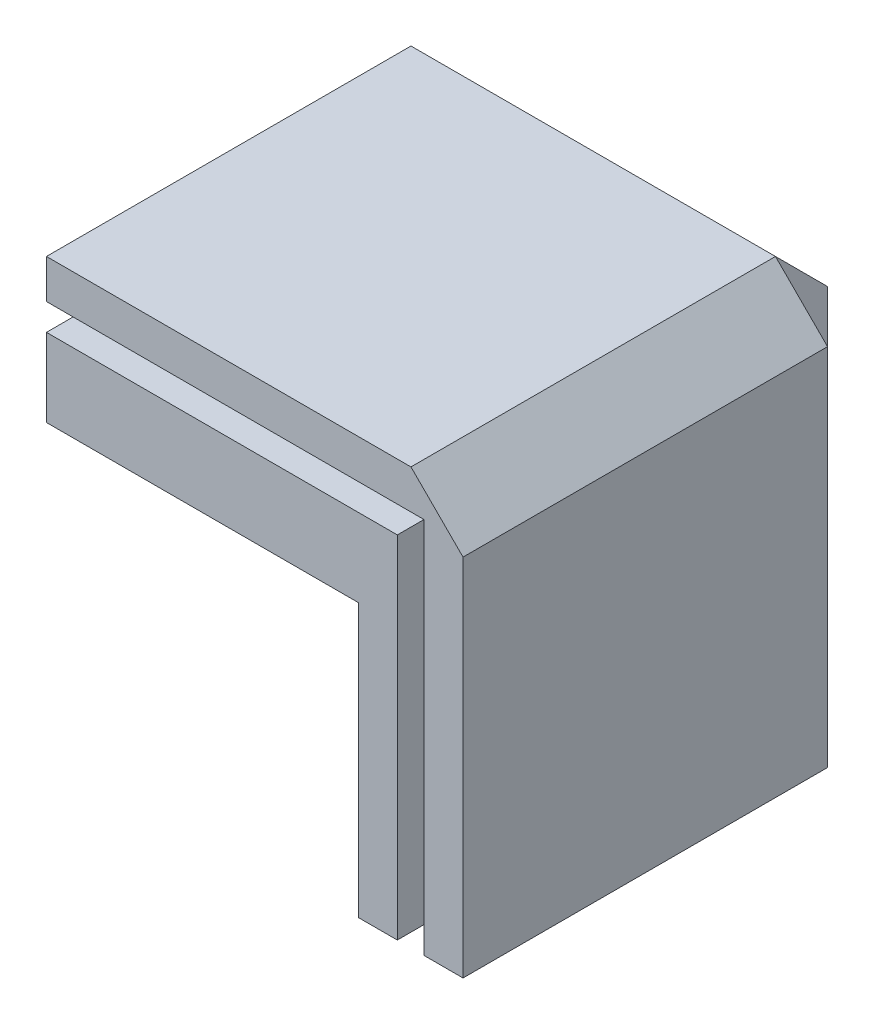
ISO-10303-21;
HEADER;
FILE_DESCRIPTION(('STEP AP214'),'2;1');
FILE_NAME('part.step','',(''),(''),'','','');
FILE_SCHEMA(('AUTOMOTIVE_DESIGN { 1 0 10303 214 1 1 1 1 }'));
ENDSEC;
DATA;
#1=APPLICATION_CONTEXT('core data for automotive mechanical design processes');
#2=APPLICATION_PROTOCOL_DEFINITION('international standard','automotive_design',2000,#1);
#3=PRODUCT_CONTEXT('',#1,'mechanical');
#4=PRODUCT('Part','Part','',(#3));
#5=PRODUCT_RELATED_PRODUCT_CATEGORY('part','',(#4));
#6=PRODUCT_DEFINITION_FORMATION('','',#4);
#7=PRODUCT_DEFINITION_CONTEXT('part definition',#1,'design');
#8=PRODUCT_DEFINITION('design','',#6,#7);
#9=PRODUCT_DEFINITION_SHAPE('','',#8);
#10=(LENGTH_UNIT() NAMED_UNIT(*) SI_UNIT(.MILLI.,.METRE.));
#11=(NAMED_UNIT(*) PLANE_ANGLE_UNIT() SI_UNIT($,.RADIAN.));
#12=(NAMED_UNIT(*) SI_UNIT($,.STERADIAN.) SOLID_ANGLE_UNIT());
#13=UNCERTAINTY_MEASURE_WITH_UNIT(LENGTH_MEASURE(1.E-05),#10,'distance_accuracy_value','');
#14=(GEOMETRIC_REPRESENTATION_CONTEXT(3) GLOBAL_UNCERTAINTY_ASSIGNED_CONTEXT((#13)) GLOBAL_UNIT_ASSIGNED_CONTEXT((#10,
#11,#12)) REPRESENTATION_CONTEXT('',''));
#15=CARTESIAN_POINT('',(0.,0.,0.));
#16=DIRECTION('',(0.,0.,1.));
#17=DIRECTION('',(1.,0.,0.));
#18=AXIS2_PLACEMENT_3D('',#15,#16,#17);
#19=CARTESIAN_POINT('',(38.0238,38.0238,0.));
#20=DIRECTION('',(1.,0.,0.));
#21=DIRECTION('',(0.,0.,-1.));
#22=AXIS2_PLACEMENT_3D('',#19,#20,#21);
#23=PLANE('',#22);
#24=DIRECTION('',(0.,0.,1.));
#25=VECTOR('',#24,1.);
#26=CARTESIAN_POINT('',(38.0238,33.2613,-38.0238));
#27=LINE('',#26,#25);
#28=CARTESIAN_POINT('',(38.0238,33.2613,-38.0238));
#29=VERTEX_POINT('',#28);
#30=CARTESIAN_POINT('',(38.0238,33.2613,0.));
#31=VERTEX_POINT('',#30);
#32=EDGE_CURVE('E400',#29,#31,#27,.T.);
#33=ORIENTED_EDGE('',*,*,#32,.F.);
#34=DIRECTION('',(0.,-1.,0.));
#35=VECTOR('',#34,1.);
#36=CARTESIAN_POINT('',(38.0238,38.0238,-38.0238));
#37=LINE('',#36,#35);
#38=CARTESIAN_POINT('',(38.0238,0.,-38.0238));
#39=VERTEX_POINT('',#38);
#40=EDGE_CURVE('E250',#29,#39,#37,.T.);
#41=ORIENTED_EDGE('',*,*,#40,.T.);
#42=DIRECTION('',(0.,0.,1.));
#43=VECTOR('',#42,1.);
#44=CARTESIAN_POINT('',(38.0238,0.,0.));
#45=LINE('',#44,#43);
#46=CARTESIAN_POINT('',(38.0238,0.,0.));
#47=VERTEX_POINT('',#46);
#48=EDGE_CURVE('E245',#39,#47,#45,.T.);
#49=ORIENTED_EDGE('',*,*,#48,.T.);
#50=DIRECTION('',(0.,-1.,0.));
#51=VECTOR('',#50,1.);
#52=CARTESIAN_POINT('',(38.0238,38.0238,0.));
#53=LINE('',#52,#51);
#54=EDGE_CURVE('E49',#31,#47,#53,.T.);
#55=ORIENTED_EDGE('',*,*,#54,.F.);
#56=EDGE_LOOP('',(#33,#41,#49,#55));
#57=FACE_BOUND('',#56,.T.);
#58=ADVANCED_FACE('F32',(#57),#23,.F.);
#59=CARTESIAN_POINT('',(0.,38.0238,-38.0238));
#60=DIRECTION('',(0.,0.,-1.));
#61=DIRECTION('',(-1.,0.,0.));
#62=AXIS2_PLACEMENT_3D('',#59,#60,#61);
#63=PLANE('',#62);
#64=DIRECTION('',(1.,0.,0.));
#65=VECTOR('',#64,1.);
#66=CARTESIAN_POINT('',(-38.3208921176165,33.2613,-38.0238));
#67=LINE('',#66,#65);
#68=CARTESIAN_POINT('',(0.,33.2613,-38.0238));
#69=VERTEX_POINT('',#68);
#70=EDGE_CURVE('E57',#69,#29,#67,.T.);
#71=ORIENTED_EDGE('',*,*,#70,.F.);
#72=DIRECTION('',(0.,-1.,0.));
#73=VECTOR('',#72,1.);
#74=CARTESIAN_POINT('',(0.,38.0238,-38.0238));
#75=LINE('',#74,#73);
#76=CARTESIAN_POINT('',(0.,0.,-38.0238));
#77=VERTEX_POINT('',#76);
#78=EDGE_CURVE('E247',#69,#77,#75,.T.);
#79=ORIENTED_EDGE('',*,*,#78,.T.);
#80=DIRECTION('',(1.,0.,0.));
#81=VECTOR('',#80,1.);
#82=CARTESIAN_POINT('',(0.,0.,-38.0238));
#83=LINE('',#82,#81);
#84=EDGE_CURVE('E232',#77,#39,#83,.T.);
#85=ORIENTED_EDGE('',*,*,#84,.T.);
#86=ORIENTED_EDGE('',*,*,#40,.F.);
#87=EDGE_LOOP('',(#71,#79,#85,#86));
#88=FACE_BOUND('',#87,.T.);
#89=ADVANCED_FACE('F416',(#88),#63,.F.);
#90=CARTESIAN_POINT('',(0.,0.,0.));
#91=DIRECTION('',(0.,-1.,0.));
#92=DIRECTION('',(0.,0.,-1.));
#93=AXIS2_PLACEMENT_3D('',#90,#91,#92);
#94=PLANE('',#93);
#95=DIRECTION('',(-1.,0.,0.));
#96=VECTOR('',#95,1.);
#97=CARTESIAN_POINT('',(31.6738,0.,-42.7863));
#98=LINE('',#97,#96);
#99=CARTESIAN_POINT('',(42.7863,0.,-42.7863));
#100=VERTEX_POINT('',#99);
#101=CARTESIAN_POINT('',(0.,0.,-42.7863));
#102=VERTEX_POINT('',#101);
#103=EDGE_CURVE('E217',#100,#102,#98,.T.);
#104=ORIENTED_EDGE('',*,*,#103,.F.);
#105=DIRECTION('',(0.,0.,-1.));
#106=VECTOR('',#105,1.);
#107=CARTESIAN_POINT('',(42.7863,0.,167.532101280624));
#108=LINE('',#107,#106);
#109=CARTESIAN_POINT('',(42.7863,0.,0.));
#110=VERTEX_POINT('',#109);
#111=EDGE_CURVE('E355',#110,#100,#108,.T.);
#112=ORIENTED_EDGE('',*,*,#111,.F.);
#113=DIRECTION('',(1.,0.,0.));
#114=VECTOR('',#113,1.);
#115=CARTESIAN_POINT('',(0.,0.,0.));
#116=LINE('',#115,#114);
#117=EDGE_CURVE('E264',#47,#110,#116,.T.);
#118=ORIENTED_EDGE('',*,*,#117,.F.);
#119=ORIENTED_EDGE('',*,*,#48,.F.);
#120=ORIENTED_EDGE('',*,*,#84,.F.);
#121=DIRECTION('',(0.,0.,1.));
#122=VECTOR('',#121,1.);
#123=CARTESIAN_POINT('',(0.,0.,0.));
#124=LINE('',#123,#122);
#125=EDGE_CURVE('E249',#102,#77,#124,.T.);
#126=ORIENTED_EDGE('',*,*,#125,.F.);
#127=EDGE_LOOP('',(#104,#112,#118,#119,#120,#126));
#128=FACE_BOUND('',#127,.T.);
#129=ADVANCED_FACE('F420',(#128),#94,.T.);
#130=CARTESIAN_POINT('',(0.,50.8,0.));
#131=DIRECTION('',(0.,0.,-1.));
#132=DIRECTION('',(-1.,0.,0.));
#133=AXIS2_PLACEMENT_3D('',#130,#131,#132);
#134=PLANE('',#133);
#135=DIRECTION('',(1.,0.,0.));
#136=VECTOR('',#135,1.);
#137=CARTESIAN_POINT('',(-38.3208921176165,33.2613,0.));
#138=LINE('',#137,#136);
#139=CARTESIAN_POINT('',(0.,33.2613,0.));
#140=VERTEX_POINT('',#139);
#141=EDGE_CURVE('E403',#140,#31,#138,.T.);
#142=ORIENTED_EDGE('',*,*,#141,.T.);
#143=ORIENTED_EDGE('',*,*,#54,.T.);
#144=ORIENTED_EDGE('',*,*,#117,.T.);
#145=DIRECTION('',(0.,1.,0.));
#146=VECTOR('',#145,1.);
#147=CARTESIAN_POINT('',(42.7863,42.7863,0.));
#148=LINE('',#147,#146);
#149=CARTESIAN_POINT('',(42.7863,42.7863,0.));
#150=VERTEX_POINT('',#149);
#151=EDGE_CURVE('E346',#110,#150,#148,.T.);
#152=ORIENTED_EDGE('',*,*,#151,.T.);
#153=DIRECTION('',(-1.,0.,0.));
#154=VECTOR('',#153,1.);
#155=CARTESIAN_POINT('',(31.6738,42.7863,0.));
#156=LINE('',#155,#154);
#157=CARTESIAN_POINT('',(0.,42.7863,0.));
#158=VERTEX_POINT('',#157);
#159=EDGE_CURVE('E235',#150,#158,#156,.T.);
#160=ORIENTED_EDGE('',*,*,#159,.T.);
#161=DIRECTION('',(0.,-1.,0.));
#162=VECTOR('',#161,1.);
#163=CARTESIAN_POINT('',(0.,50.8,0.));
#164=LINE('',#163,#162);
#165=EDGE_CURVE('E275',#158,#140,#164,.T.);
#166=ORIENTED_EDGE('',*,*,#165,.T.);
#167=EDGE_LOOP('',(#142,#143,#144,#152,#160,#166));
#168=FACE_BOUND('',#167,.T.);
#169=ADVANCED_FACE('F446',(#168),#134,.F.);
#170=DIRECTION('',(0.,-1.,0.));
#171=VECTOR('',#170,1.);
#172=CARTESIAN_POINT('',(50.8,50.8,0.));
#173=LINE('',#172,#171);
#174=CARTESIAN_POINT('',(50.8,44.45,0.));
#175=VERTEX_POINT('',#174);
#176=CARTESIAN_POINT('',(50.8,0.,0.));
#177=VERTEX_POINT('',#176);
#178=EDGE_CURVE('E273',#175,#177,#173,.T.);
#179=ORIENTED_EDGE('',*,*,#178,.F.);
#180=DIRECTION('',(0.707106781186547,-0.707106781186548,0.));
#181=VECTOR('',#180,1.);
#182=CARTESIAN_POINT('',(44.45,50.8,0.));
#183=LINE('',#182,#181);
#184=CARTESIAN_POINT('',(44.45,50.8,0.));
#185=VERTEX_POINT('',#184);
#186=EDGE_CURVE('E288',#175,#185,#183,.F.);
#187=ORIENTED_EDGE('',*,*,#186,.T.);
#188=DIRECTION('',(1.,0.,0.));
#189=VECTOR('',#188,1.);
#190=CARTESIAN_POINT('',(0.,50.8,0.));
#191=LINE('',#190,#189);
#192=CARTESIAN_POINT('',(0.,50.8,0.));
#193=VERTEX_POINT('',#192);
#194=EDGE_CURVE('E255',#193,#185,#191,.T.);
#195=ORIENTED_EDGE('',*,*,#194,.F.);
#196=CARTESIAN_POINT('',(0.,46.0375,0.));
#197=VERTEX_POINT('',#196);
#198=EDGE_CURVE('E276',#193,#197,#164,.T.);
#199=ORIENTED_EDGE('',*,*,#198,.T.);
#200=DIRECTION('',(-1.,0.,0.));
#201=VECTOR('',#200,1.);
#202=CARTESIAN_POINT('',(31.6738,46.0375,0.));
#203=LINE('',#202,#201);
#204=CARTESIAN_POINT('',(46.0375,46.0375,0.));
#205=VERTEX_POINT('',#204);
#206=EDGE_CURVE('E233',#205,#197,#203,.T.);
#207=ORIENTED_EDGE('',*,*,#206,.F.);
#208=DIRECTION('',(0.,-1.,0.));
#209=VECTOR('',#208,1.);
#210=CARTESIAN_POINT('',(46.0375,46.0375,0.));
#211=LINE('',#210,#209);
#212=CARTESIAN_POINT('',(46.0375,0.,0.));
#213=VERTEX_POINT('',#212);
#214=EDGE_CURVE('E342',#205,#213,#211,.T.);
#215=ORIENTED_EDGE('',*,*,#214,.T.);
#216=EDGE_CURVE('E263',#213,#177,#116,.T.);
#217=ORIENTED_EDGE('',*,*,#216,.T.);
#218=EDGE_LOOP('',(#179,#187,#195,#199,#207,#215,#217));
#219=FACE_BOUND('',#218,.T.);
#220=ADVANCED_FACE('F449',(#219),#134,.F.);
#221=CARTESIAN_POINT('',(0.,50.8,0.));
#222=DIRECTION('',(1.,0.,0.));
#223=DIRECTION('',(0.,0.,-1.));
#224=AXIS2_PLACEMENT_3D('',#221,#222,#223);
#225=PLANE('',#224);
#226=DIRECTION('',(0.,0.,1.));
#227=VECTOR('',#226,1.);
#228=CARTESIAN_POINT('',(0.,50.8,0.));
#229=LINE('',#228,#227);
#230=CARTESIAN_POINT('',(0.,50.8,-44.45));
#231=VERTEX_POINT('',#230);
#232=EDGE_CURVE('E253',#231,#193,#229,.T.);
#233=ORIENTED_EDGE('',*,*,#232,.F.);
#234=DIRECTION('',(0.,0.707106781186548,0.707106781186547));
#235=VECTOR('',#234,1.);
#236=CARTESIAN_POINT('',(0.,50.8,-44.45));
#237=LINE('',#236,#235);
#238=CARTESIAN_POINT('',(0.,44.45,-50.8));
#239=VERTEX_POINT('',#238);
#240=EDGE_CURVE('E11',#231,#239,#237,.F.);
#241=ORIENTED_EDGE('',*,*,#240,.T.);
#242=DIRECTION('',(0.,-1.,0.));
#243=VECTOR('',#242,1.);
#244=CARTESIAN_POINT('',(0.,50.8,-50.8));
#245=LINE('',#244,#243);
#246=CARTESIAN_POINT('',(0.,0.,-50.8));
#247=VERTEX_POINT('',#246);
#248=EDGE_CURVE('E259',#239,#247,#245,.T.);
#249=ORIENTED_EDGE('',*,*,#248,.T.);
#250=CARTESIAN_POINT('',(0.,0.,-46.0375));
#251=VERTEX_POINT('',#250);
#252=EDGE_CURVE('E260',#247,#251,#124,.T.);
#253=ORIENTED_EDGE('',*,*,#252,.T.);
#254=DIRECTION('',(0.,-1.,0.));
#255=VECTOR('',#254,1.);
#256=CARTESIAN_POINT('',(0.,46.0375,-46.0375));
#257=LINE('',#256,#255);
#258=CARTESIAN_POINT('',(0.,46.0375,-46.0375));
#259=VERTEX_POINT('',#258);
#260=EDGE_CURVE('E219',#259,#251,#257,.T.);
#261=ORIENTED_EDGE('',*,*,#260,.F.);
#262=DIRECTION('',(0.,0.,-1.));
#263=VECTOR('',#262,1.);
#264=CARTESIAN_POINT('',(0.,46.0375,0.));
#265=LINE('',#264,#263);
#266=EDGE_CURVE('E221',#197,#259,#265,.T.);
#267=ORIENTED_EDGE('',*,*,#266,.F.);
#268=ORIENTED_EDGE('',*,*,#198,.F.);
#269=EDGE_LOOP('',(#233,#241,#249,#253,#261,#267,#268));
#270=FACE_BOUND('',#269,.T.);
#271=ADVANCED_FACE('F452',(#270),#225,.F.);
#272=DIRECTION('',(0.,0.,1.));
#273=VECTOR('',#272,1.);
#274=CARTESIAN_POINT('',(0.,42.7863,-42.7863));
#275=LINE('',#274,#273);
#276=CARTESIAN_POINT('',(0.,42.7863,-17.0053));
#277=VERTEX_POINT('',#276);
#278=EDGE_CURVE('E218',#277,#158,#275,.T.);
#279=ORIENTED_EDGE('',*,*,#278,.F.);
#280=DIRECTION('',(0.,1.,0.));
#281=VECTOR('',#280,1.);
#282=CARTESIAN_POINT('',(0.,42.7863,-17.0053));
#283=LINE('',#282,#281);
#284=CARTESIAN_POINT('',(0.,39.5605,-17.0053));
#285=VERTEX_POINT('',#284);
#286=EDGE_CURVE('E205',#285,#277,#283,.T.);
#287=ORIENTED_EDGE('',*,*,#286,.F.);
#288=DIRECTION('',(0.,0.,1.));
#289=VECTOR('',#288,1.);
#290=CARTESIAN_POINT('',(0.,39.5605,-42.7863));
#291=LINE('',#290,#289);
#292=CARTESIAN_POINT('',(0.,39.5605,-42.7863));
#293=VERTEX_POINT('',#292);
#294=EDGE_CURVE('E196',#293,#285,#291,.T.);
#295=ORIENTED_EDGE('',*,*,#294,.F.);
#296=DIRECTION('',(0.,1.,0.));
#297=VECTOR('',#296,1.);
#298=CARTESIAN_POINT('',(0.,0.,-42.7863));
#299=LINE('',#298,#297);
#300=EDGE_CURVE('E212',#102,#293,#299,.T.);
#301=ORIENTED_EDGE('',*,*,#300,.F.);
#302=ORIENTED_EDGE('',*,*,#125,.T.);
#303=ORIENTED_EDGE('',*,*,#78,.F.);
#304=DIRECTION('',(0.,0.,-1.));
#305=VECTOR('',#304,1.);
#306=CARTESIAN_POINT('',(0.,33.2613,-38.0238));
#307=LINE('',#306,#305);
#308=EDGE_CURVE('E297',#140,#69,#307,.T.);
#309=ORIENTED_EDGE('',*,*,#308,.F.);
#310=ORIENTED_EDGE('',*,*,#165,.F.);
#311=EDGE_LOOP('',(#279,#287,#295,#301,#302,#303,#309,#310));
#312=FACE_BOUND('',#311,.T.);
#313=ADVANCED_FACE('F210',(#312),#225,.F.);
#314=CARTESIAN_POINT('',(50.8,50.8,0.));
#315=DIRECTION('',(-1.,0.,0.));
#316=DIRECTION('',(0.,0.,1.));
#317=AXIS2_PLACEMENT_3D('',#314,#315,#316);
#318=PLANE('',#317);
#319=DIRECTION('',(0.,1.,0.));
#320=VECTOR('',#319,1.);
#321=CARTESIAN_POINT('',(50.8,50.8,-44.45));
#322=LINE('',#321,#320);
#323=CARTESIAN_POINT('',(50.8,0.,-44.45));
#324=VERTEX_POINT('',#323);
#325=CARTESIAN_POINT('',(50.8,44.45,-44.45));
#326=VERTEX_POINT('',#325);
#327=EDGE_CURVE('E284',#324,#326,#322,.T.);
#328=ORIENTED_EDGE('',*,*,#327,.T.);
#329=DIRECTION('',(0.,0.,1.));
#330=VECTOR('',#329,1.);
#331=CARTESIAN_POINT('',(50.8,44.45,0.));
#332=LINE('',#331,#330);
#333=EDGE_CURVE('E286',#326,#175,#332,.T.);
#334=ORIENTED_EDGE('',*,*,#333,.T.);
#335=ORIENTED_EDGE('',*,*,#178,.T.);
#336=DIRECTION('',(0.,0.,-1.));
#337=VECTOR('',#336,1.);
#338=CARTESIAN_POINT('',(50.8,0.,0.));
#339=LINE('',#338,#337);
#340=EDGE_CURVE('E267',#177,#324,#339,.T.);
#341=ORIENTED_EDGE('',*,*,#340,.T.);
#342=EDGE_LOOP('',(#328,#334,#335,#341));
#343=FACE_BOUND('',#342,.T.);
#344=ADVANCED_FACE('F441',(#343),#318,.F.);
#345=CARTESIAN_POINT('',(0.,50.8,-50.8));
#346=DIRECTION('',(0.,0.,1.));
#347=DIRECTION('',(1.,0.,0.));
#348=AXIS2_PLACEMENT_3D('',#345,#346,#347);
#349=PLANE('',#348);
#350=DIRECTION('',(1.,0.,0.));
#351=VECTOR('',#350,1.);
#352=CARTESIAN_POINT('',(0.,44.45,-50.8));
#353=LINE('',#352,#351);
#354=CARTESIAN_POINT('',(44.45,44.45,-50.8));
#355=VERTEX_POINT('',#354);
#356=EDGE_CURVE('E290',#239,#355,#353,.T.);
#357=ORIENTED_EDGE('',*,*,#356,.T.);
#358=DIRECTION('',(0.,-1.,0.));
#359=VECTOR('',#358,1.);
#360=CARTESIAN_POINT('',(44.45,50.8,-50.8));
#361=LINE('',#360,#359);
#362=CARTESIAN_POINT('',(44.45,0.,-50.8));
#363=VERTEX_POINT('',#362);
#364=EDGE_CURVE('E292',#355,#363,#361,.T.);
#365=ORIENTED_EDGE('',*,*,#364,.T.);
#366=DIRECTION('',(-1.,0.,0.));
#367=VECTOR('',#366,1.);
#368=CARTESIAN_POINT('',(0.,0.,-50.8));
#369=LINE('',#368,#367);
#370=EDGE_CURVE('E256',#363,#247,#369,.T.);
#371=ORIENTED_EDGE('',*,*,#370,.T.);
#372=ORIENTED_EDGE('',*,*,#248,.F.);
#373=EDGE_LOOP('',(#357,#365,#371,#372));
#374=FACE_BOUND('',#373,.T.);
#375=ADVANCED_FACE('F434',(#374),#349,.F.);
#376=CARTESIAN_POINT('',(0.,50.8,0.));
#377=DIRECTION('',(0.,-1.,0.));
#378=DIRECTION('',(0.,0.,-1.));
#379=AXIS2_PLACEMENT_3D('',#376,#377,#378);
#380=PLANE('',#379);
#381=ORIENTED_EDGE('',*,*,#194,.T.);
#382=DIRECTION('',(0.,0.,-1.));
#383=VECTOR('',#382,1.);
#384=CARTESIAN_POINT('',(44.45,50.8,0.));
#385=LINE('',#384,#383);
#386=CARTESIAN_POINT('',(44.45,50.8,-44.45));
#387=VERTEX_POINT('',#386);
#388=EDGE_CURVE('E281',#185,#387,#385,.T.);
#389=ORIENTED_EDGE('',*,*,#388,.T.);
#390=DIRECTION('',(-1.,0.,0.));
#391=VECTOR('',#390,1.);
#392=CARTESIAN_POINT('',(0.,50.8,-44.45));
#393=LINE('',#392,#391);
#394=EDGE_CURVE('E279',#387,#231,#393,.T.);
#395=ORIENTED_EDGE('',*,*,#394,.T.);
#396=ORIENTED_EDGE('',*,*,#232,.T.);
#397=EDGE_LOOP('',(#381,#389,#395,#396));
#398=FACE_BOUND('',#397,.T.);
#399=ADVANCED_FACE('F430',(#398),#380,.F.);
#400=ORIENTED_EDGE('',*,*,#370,.F.);
#401=DIRECTION('',(-0.707106781186548,0.,-0.707106781186547));
#402=VECTOR('',#401,1.);
#403=CARTESIAN_POINT('',(47.6249999999999,0.,-47.625));
#404=LINE('',#403,#402);
#405=EDGE_CURVE('E41',#363,#324,#404,.F.);
#406=ORIENTED_EDGE('',*,*,#405,.T.);
#407=ORIENTED_EDGE('',*,*,#340,.F.);
#408=ORIENTED_EDGE('',*,*,#216,.F.);
#409=DIRECTION('',(0.,0.,-1.));
#410=VECTOR('',#409,1.);
#411=CARTESIAN_POINT('',(46.0375,0.,167.532101280624));
#412=LINE('',#411,#410);
#413=CARTESIAN_POINT('',(46.0375,0.,-46.0375));
#414=VERTEX_POINT('',#413);
#415=EDGE_CURVE('E352',#213,#414,#412,.T.);
#416=ORIENTED_EDGE('',*,*,#415,.T.);
#417=DIRECTION('',(-1.,0.,0.));
#418=VECTOR('',#417,1.);
#419=CARTESIAN_POINT('',(31.6738,0.,-46.0375));
#420=LINE('',#419,#418);
#421=EDGE_CURVE('E239',#414,#251,#420,.T.);
#422=ORIENTED_EDGE('',*,*,#421,.T.);
#423=ORIENTED_EDGE('',*,*,#252,.F.);
#424=EDGE_LOOP('',(#400,#406,#407,#408,#416,#422,#423));
#425=FACE_BOUND('',#424,.T.);
#426=ADVANCED_FACE('F433',(#425),#94,.T.);
#427=CARTESIAN_POINT('',(31.6738,46.0375,-46.0375));
#428=DIRECTION('',(0.,0.,-1.));
#429=DIRECTION('',(0.,1.,0.));
#430=AXIS2_PLACEMENT_3D('',#427,#428,#429);
#431=PLANE('',#430);
#432=ORIENTED_EDGE('',*,*,#260,.T.);
#433=ORIENTED_EDGE('',*,*,#421,.F.);
#434=DIRECTION('',(0.,-1.,0.));
#435=VECTOR('',#434,1.);
#436=CARTESIAN_POINT('',(46.0375,31.6738,-46.0375));
#437=LINE('',#436,#435);
#438=CARTESIAN_POINT('',(46.0375,31.6738,-46.0375));
#439=VERTEX_POINT('',#438);
#440=EDGE_CURVE('E327',#439,#414,#437,.T.);
#441=ORIENTED_EDGE('',*,*,#440,.F.);
#442=DIRECTION('',(1.,0.,0.));
#443=VECTOR('',#442,1.);
#444=CARTESIAN_POINT('',(31.6738,31.6738,-46.0375));
#445=LINE('',#444,#443);
#446=CARTESIAN_POINT('',(31.6738,31.6738,-46.0375));
#447=VERTEX_POINT('',#446);
#448=EDGE_CURVE('E307',#447,#439,#445,.T.);
#449=ORIENTED_EDGE('',*,*,#448,.F.);
#450=DIRECTION('',(0.,-1.,0.));
#451=VECTOR('',#450,1.);
#452=CARTESIAN_POINT('',(31.6738,46.0375,-46.0375));
#453=LINE('',#452,#451);
#454=CARTESIAN_POINT('',(31.6738,46.0375,-46.0375));
#455=VERTEX_POINT('',#454);
#456=EDGE_CURVE('E229',#455,#447,#453,.T.);
#457=ORIENTED_EDGE('',*,*,#456,.F.);
#458=DIRECTION('',(-1.,0.,0.));
#459=VECTOR('',#458,1.);
#460=CARTESIAN_POINT('',(31.6738,46.0375,-46.0375));
#461=LINE('',#460,#459);
#462=EDGE_CURVE('E230',#455,#259,#461,.T.);
#463=ORIENTED_EDGE('',*,*,#462,.T.);
#464=EDGE_LOOP('',(#432,#433,#441,#449,#457,#463));
#465=FACE_BOUND('',#464,.T.);
#466=ADVANCED_FACE('F375',(#465),#431,.F.);
#467=CARTESIAN_POINT('',(31.6738,46.0375,0.));
#468=DIRECTION('',(0.,1.,0.));
#469=DIRECTION('',(0.,0.,1.));
#470=AXIS2_PLACEMENT_3D('',#467,#468,#469);
#471=PLANE('',#470);
#472=ORIENTED_EDGE('',*,*,#266,.T.);
#473=ORIENTED_EDGE('',*,*,#462,.F.);
#474=DIRECTION('',(0.,0.,-1.));
#475=VECTOR('',#474,1.);
#476=CARTESIAN_POINT('',(31.6738,46.0375,0.));
#477=LINE('',#476,#475);
#478=CARTESIAN_POINT('',(31.6738,46.0375,-31.6738));
#479=VERTEX_POINT('',#478);
#480=EDGE_CURVE('E242',#479,#455,#477,.T.);
#481=ORIENTED_EDGE('',*,*,#480,.F.);
#482=DIRECTION('',(1.,0.,0.));
#483=VECTOR('',#482,1.);
#484=CARTESIAN_POINT('',(31.6738,46.0375,-31.6738));
#485=LINE('',#484,#483);
#486=CARTESIAN_POINT('',(46.0375,46.0375,-31.6738));
#487=VERTEX_POINT('',#486);
#488=EDGE_CURVE('E338',#479,#487,#485,.T.);
#489=ORIENTED_EDGE('',*,*,#488,.T.);
#490=DIRECTION('',(0.,0.,-1.));
#491=VECTOR('',#490,1.);
#492=CARTESIAN_POINT('',(46.0375,46.0375,167.532101280624));
#493=LINE('',#492,#491);
#494=EDGE_CURVE('E336',#205,#487,#493,.T.);
#495=ORIENTED_EDGE('',*,*,#494,.F.);
#496=ORIENTED_EDGE('',*,*,#206,.T.);
#497=EDGE_LOOP('',(#472,#473,#481,#489,#495,#496));
#498=FACE_BOUND('',#497,.T.);
#499=ADVANCED_FACE('F371',(#498),#471,.F.);
#500=CARTESIAN_POINT('',(31.6738,42.7863,-42.7863));
#501=DIRECTION('',(0.,-1.,0.));
#502=DIRECTION('',(0.,0.,-1.));
#503=AXIS2_PLACEMENT_3D('',#500,#501,#502);
#504=PLANE('',#503);
#505=DIRECTION('',(0.,0.,1.));
#506=VECTOR('',#505,1.);
#507=CARTESIAN_POINT('',(31.6738,42.7863,-42.7863));
#508=LINE('',#507,#506);
#509=CARTESIAN_POINT('',(31.6738,42.7863,-31.6738));
#510=VERTEX_POINT('',#509);
#511=CARTESIAN_POINT('',(31.6738,42.7863,-17.0053));
#512=VERTEX_POINT('',#511);
#513=EDGE_CURVE('E392',#510,#512,#508,.T.);
#514=ORIENTED_EDGE('',*,*,#513,.T.);
#515=DIRECTION('',(-1.,0.,0.));
#516=VECTOR('',#515,1.);
#517=CARTESIAN_POINT('',(57.6558273774007,42.7863,-17.0053));
#518=LINE('',#517,#516);
#519=EDGE_CURVE('E697',#512,#277,#518,.T.);
#520=ORIENTED_EDGE('',*,*,#519,.T.);
#521=ORIENTED_EDGE('',*,*,#278,.T.);
#522=ORIENTED_EDGE('',*,*,#159,.F.);
#523=DIRECTION('',(0.,0.,-1.));
#524=VECTOR('',#523,1.);
#525=CARTESIAN_POINT('',(42.7863,42.7863,167.532101280624));
#526=LINE('',#525,#524);
#527=CARTESIAN_POINT('',(42.7863,42.7863,-31.6738));
#528=VERTEX_POINT('',#527);
#529=EDGE_CURVE('E223',#150,#528,#526,.T.);
#530=ORIENTED_EDGE('',*,*,#529,.T.);
#531=DIRECTION('',(-1.,0.,0.));
#532=VECTOR('',#531,1.);
#533=CARTESIAN_POINT('',(31.6738,42.7863,-31.6738));
#534=LINE('',#533,#532);
#535=EDGE_CURVE('E333',#528,#510,#534,.T.);
#536=ORIENTED_EDGE('',*,*,#535,.T.);
#537=EDGE_LOOP('',(#514,#520,#521,#522,#530,#536));
#538=FACE_BOUND('',#537,.T.);
#539=ADVANCED_FACE('F390',(#538),#504,.F.);
#540=CARTESIAN_POINT('',(31.6738,0.,-42.7863));
#541=DIRECTION('',(0.,0.,1.));
#542=DIRECTION('',(1.,0.,0.));
#543=AXIS2_PLACEMENT_3D('',#540,#541,#542);
#544=PLANE('',#543);
#545=ORIENTED_EDGE('',*,*,#300,.T.);
#546=DIRECTION('',(-1.,0.,0.));
#547=VECTOR('',#546,1.);
#548=CARTESIAN_POINT('',(57.6558273774007,39.5605,-42.7863));
#549=LINE('',#548,#547);
#550=CARTESIAN_POINT('',(31.6738,39.5605,-42.7863));
#551=VERTEX_POINT('',#550);
#552=EDGE_CURVE('E192',#551,#293,#549,.T.);
#553=ORIENTED_EDGE('',*,*,#552,.F.);
#554=DIRECTION('',(0.,1.,0.));
#555=VECTOR('',#554,1.);
#556=CARTESIAN_POINT('',(31.6738,0.,-42.7863));
#557=LINE('',#556,#555);
#558=CARTESIAN_POINT('',(31.6738,31.6738,-42.7863));
#559=VERTEX_POINT('',#558);
#560=EDGE_CURVE('E362',#559,#551,#557,.T.);
#561=ORIENTED_EDGE('',*,*,#560,.F.);
#562=DIRECTION('',(-1.,0.,0.));
#563=VECTOR('',#562,1.);
#564=CARTESIAN_POINT('',(31.6738,31.6738,-42.7863));
#565=LINE('',#564,#563);
#566=CARTESIAN_POINT('',(42.7863,31.6738,-42.7863));
#567=VERTEX_POINT('',#566);
#568=EDGE_CURVE('E325',#567,#559,#565,.T.);
#569=ORIENTED_EDGE('',*,*,#568,.F.);
#570=DIRECTION('',(0.,-1.,0.));
#571=VECTOR('',#570,1.);
#572=CARTESIAN_POINT('',(42.7863,31.6738,-42.7863));
#573=LINE('',#572,#571);
#574=EDGE_CURVE('E328',#567,#100,#573,.T.);
#575=ORIENTED_EDGE('',*,*,#574,.T.);
#576=ORIENTED_EDGE('',*,*,#103,.T.);
#577=EDGE_LOOP('',(#545,#553,#561,#569,#575,#576));
#578=FACE_BOUND('',#577,.T.);
#579=ADVANCED_FACE('F215',(#578),#544,.F.);
#580=CARTESIAN_POINT('',(31.6738,0.,0.));
#581=DIRECTION('',(-1.,0.,0.));
#582=DIRECTION('',(0.,0.,1.));
#583=AXIS2_PLACEMENT_3D('',#580,#581,#582);
#584=PLANE('',#583);
#585=DIRECTION('',(0.,0.,-1.));
#586=VECTOR('',#585,1.);
#587=CARTESIAN_POINT('',(31.6738,31.6738,-46.0375));
#588=LINE('',#587,#586);
#589=EDGE_CURVE('E303',#559,#447,#588,.T.);
#590=ORIENTED_EDGE('',*,*,#589,.F.);
#591=ORIENTED_EDGE('',*,*,#560,.T.);
#592=DIRECTION('',(0.,0.,-1.));
#593=VECTOR('',#592,1.);
#594=CARTESIAN_POINT('',(31.6738,39.5605,-42.7863));
#595=LINE('',#594,#593);
#596=CARTESIAN_POINT('',(31.6738,39.5605,-17.0053));
#597=VERTEX_POINT('',#596);
#598=EDGE_CURVE('E199',#597,#551,#595,.T.);
#599=ORIENTED_EDGE('',*,*,#598,.F.);
#600=DIRECTION('',(0.,-1.,0.));
#601=VECTOR('',#600,1.);
#602=CARTESIAN_POINT('',(31.6738,42.7863,-17.0053));
#603=LINE('',#602,#601);
#604=EDGE_CURVE('E398',#512,#597,#603,.T.);
#605=ORIENTED_EDGE('',*,*,#604,.F.);
#606=ORIENTED_EDGE('',*,*,#513,.F.);
#607=DIRECTION('',(0.,1.,0.));
#608=VECTOR('',#607,1.);
#609=CARTESIAN_POINT('',(31.6738,46.0375,-31.6738));
#610=LINE('',#609,#608);
#611=EDGE_CURVE('E330',#510,#479,#610,.T.);
#612=ORIENTED_EDGE('',*,*,#611,.T.);
#613=ORIENTED_EDGE('',*,*,#480,.T.);
#614=ORIENTED_EDGE('',*,*,#456,.T.);
#615=EDGE_LOOP('',(#590,#591,#599,#605,#606,#612,#613,#614));
#616=FACE_BOUND('',#615,.T.);
#617=ADVANCED_FACE('F366',(#616),#584,.T.);
#618=CARTESIAN_POINT('',(42.7863,42.7863,167.532101280624));
#619=DIRECTION('',(1.,0.,0.));
#620=DIRECTION('',(0.,1.,0.));
#621=AXIS2_PLACEMENT_3D('',#618,#619,#620);
#622=PLANE('',#621);
#623=ORIENTED_EDGE('',*,*,#151,.F.);
#624=ORIENTED_EDGE('',*,*,#111,.T.);
#625=ORIENTED_EDGE('',*,*,#574,.F.);
#626=DIRECTION('',(0.,0.,-1.));
#627=VECTOR('',#626,1.);
#628=CARTESIAN_POINT('',(42.7863,31.6738,-31.6738));
#629=LINE('',#628,#627);
#630=CARTESIAN_POINT('',(42.7863,31.6738,-31.6738));
#631=VERTEX_POINT('',#630);
#632=EDGE_CURVE('E322',#631,#567,#629,.T.);
#633=ORIENTED_EDGE('',*,*,#632,.F.);
#634=DIRECTION('',(0.,1.,0.));
#635=VECTOR('',#634,1.);
#636=CARTESIAN_POINT('',(42.7863,42.7863,-31.6738));
#637=LINE('',#636,#635);
#638=EDGE_CURVE('E337',#631,#528,#637,.T.);
#639=ORIENTED_EDGE('',*,*,#638,.T.);
#640=ORIENTED_EDGE('',*,*,#529,.F.);
#641=EDGE_LOOP('',(#623,#624,#625,#633,#639,#640));
#642=FACE_BOUND('',#641,.T.);
#643=ADVANCED_FACE('F396',(#642),#622,.T.);
#644=CARTESIAN_POINT('',(46.0375,46.0375,167.532101280624));
#645=DIRECTION('',(-1.,0.,0.));
#646=DIRECTION('',(0.,0.,1.));
#647=AXIS2_PLACEMENT_3D('',#644,#645,#646);
#648=PLANE('',#647);
#649=ORIENTED_EDGE('',*,*,#214,.F.);
#650=ORIENTED_EDGE('',*,*,#494,.T.);
#651=DIRECTION('',(0.,-1.,0.));
#652=VECTOR('',#651,1.);
#653=CARTESIAN_POINT('',(46.0375,46.0375,-31.6738));
#654=LINE('',#653,#652);
#655=CARTESIAN_POINT('',(46.0375,31.6738,-31.6738));
#656=VERTEX_POINT('',#655);
#657=EDGE_CURVE('E341',#487,#656,#654,.T.);
#658=ORIENTED_EDGE('',*,*,#657,.T.);
#659=DIRECTION('',(0.,0.,1.));
#660=VECTOR('',#659,1.);
#661=CARTESIAN_POINT('',(46.0375,31.6738,-31.6738));
#662=LINE('',#661,#660);
#663=EDGE_CURVE('E313',#439,#656,#662,.T.);
#664=ORIENTED_EDGE('',*,*,#663,.F.);
#665=ORIENTED_EDGE('',*,*,#440,.T.);
#666=ORIENTED_EDGE('',*,*,#415,.F.);
#667=EDGE_LOOP('',(#649,#650,#658,#664,#665,#666));
#668=FACE_BOUND('',#667,.T.);
#669=ADVANCED_FACE('F385',(#668),#648,.T.);
#670=CARTESIAN_POINT('',(0.,50.8,-31.6738));
#671=DIRECTION('',(0.,0.,-1.));
#672=DIRECTION('',(-1.,0.,0.));
#673=AXIS2_PLACEMENT_3D('',#670,#671,#672);
#674=PLANE('',#673);
#675=ORIENTED_EDGE('',*,*,#638,.F.);
#676=DIRECTION('',(-1.,0.,0.));
#677=VECTOR('',#676,1.);
#678=CARTESIAN_POINT('',(42.7863,31.6738,-31.6738));
#679=LINE('',#678,#677);
#680=EDGE_CURVE('E319',#656,#631,#679,.T.);
#681=ORIENTED_EDGE('',*,*,#680,.F.);
#682=ORIENTED_EDGE('',*,*,#657,.F.);
#683=ORIENTED_EDGE('',*,*,#488,.F.);
#684=ORIENTED_EDGE('',*,*,#611,.F.);
#685=ORIENTED_EDGE('',*,*,#535,.F.);
#686=EDGE_LOOP('',(#675,#681,#682,#683,#684,#685));
#687=FACE_BOUND('',#686,.T.);
#688=ADVANCED_FACE('F382',(#687),#674,.F.);
#689=CARTESIAN_POINT('',(0.,31.6738,0.));
#690=DIRECTION('',(0.,1.,0.));
#691=DIRECTION('',(0.,0.,1.));
#692=AXIS2_PLACEMENT_3D('',#689,#690,#691);
#693=PLANE('',#692);
#694=ORIENTED_EDGE('',*,*,#589,.T.);
#695=ORIENTED_EDGE('',*,*,#448,.T.);
#696=ORIENTED_EDGE('',*,*,#663,.T.);
#697=ORIENTED_EDGE('',*,*,#680,.T.);
#698=ORIENTED_EDGE('',*,*,#632,.T.);
#699=ORIENTED_EDGE('',*,*,#568,.T.);
#700=EDGE_LOOP('',(#694,#695,#696,#697,#698,#699));
#701=FACE_BOUND('',#700,.T.);
#702=ADVANCED_FACE('F377',(#701),#693,.F.);
#703=CARTESIAN_POINT('',(0.,50.8,-44.45));
#704=DIRECTION('',(0.,-0.707106781186547,0.707106781186548));
#705=DIRECTION('',(-1.,0.,0.));
#706=AXIS2_PLACEMENT_3D('',#703,#704,#705);
#707=PLANE('',#706);
#708=ORIENTED_EDGE('',*,*,#240,.F.);
#709=ORIENTED_EDGE('',*,*,#394,.F.);
#710=DIRECTION('',(0.,-0.707106781186548,-0.707106781186547));
#711=VECTOR('',#710,1.);
#712=CARTESIAN_POINT('',(44.45,50.8,-44.45));
#713=LINE('',#712,#711);
#714=EDGE_CURVE('E36',#355,#387,#713,.F.);
#715=ORIENTED_EDGE('',*,*,#714,.F.);
#716=ORIENTED_EDGE('',*,*,#356,.F.);
#717=EDGE_LOOP('',(#708,#709,#715,#716));
#718=FACE_BOUND('',#717,.T.);
#719=ADVANCED_FACE('F34',(#718),#707,.F.);
#720=CARTESIAN_POINT('',(44.45,50.8,-50.8));
#721=DIRECTION('',(-0.707106781186547,0.,0.707106781186548));
#722=DIRECTION('',(0.,-1.,0.));
#723=AXIS2_PLACEMENT_3D('',#720,#721,#722);
#724=PLANE('',#723);
#725=ORIENTED_EDGE('',*,*,#405,.F.);
#726=ORIENTED_EDGE('',*,*,#364,.F.);
#727=DIRECTION('',(0.707106781186548,0.,0.707106781186547));
#728=VECTOR('',#727,1.);
#729=CARTESIAN_POINT('',(47.625,44.45,-47.625));
#730=LINE('',#729,#728);
#731=EDGE_CURVE('E296',#326,#355,#730,.F.);
#732=ORIENTED_EDGE('',*,*,#731,.F.);
#733=ORIENTED_EDGE('',*,*,#327,.F.);
#734=EDGE_LOOP('',(#725,#726,#732,#733));
#735=FACE_BOUND('',#734,.T.);
#736=ADVANCED_FACE('F459',(#735),#724,.F.);
#737=CARTESIAN_POINT('',(44.45,50.8,-44.45));
#738=DIRECTION('',(0.577350269189626,0.577350269189625,-0.577350269189627));
#739=DIRECTION('',(-0.707106781186548,0.,-0.707106781186547));
#740=AXIS2_PLACEMENT_3D('',#737,#738,#739);
#741=PLANE('',#740);
#742=ORIENTED_EDGE('',*,*,#731,.T.);
#743=ORIENTED_EDGE('',*,*,#714,.T.);
#744=DIRECTION('',(-0.707106781186547,0.707106781186548,0.));
#745=VECTOR('',#744,1.);
#746=CARTESIAN_POINT('',(44.45,50.8,-44.45));
#747=LINE('',#746,#745);
#748=EDGE_CURVE('E295',#326,#387,#747,.T.);
#749=ORIENTED_EDGE('',*,*,#748,.F.);
#750=EDGE_LOOP('',(#742,#743,#749));
#751=FACE_BOUND('',#750,.T.);
#752=ADVANCED_FACE('F456',(#751),#741,.T.);
#753=CARTESIAN_POINT('',(44.45,50.8,0.));
#754=DIRECTION('',(-0.707106781186548,-0.707106781186547,0.));
#755=DIRECTION('',(0.,0.,-1.));
#756=AXIS2_PLACEMENT_3D('',#753,#754,#755);
#757=PLANE('',#756);
#758=ORIENTED_EDGE('',*,*,#186,.F.);
#759=ORIENTED_EDGE('',*,*,#333,.F.);
#760=ORIENTED_EDGE('',*,*,#748,.T.);
#761=ORIENTED_EDGE('',*,*,#388,.F.);
#762=EDGE_LOOP('',(#758,#759,#760,#761));
#763=FACE_BOUND('',#762,.T.);
#764=ADVANCED_FACE('F453',(#763),#757,.F.);
#765=CARTESIAN_POINT('',(-38.3208921176165,33.2613,-38.0238));
#766=DIRECTION('',(0.,1.,0.));
#767=DIRECTION('',(0.,0.,1.));
#768=AXIS2_PLACEMENT_3D('',#765,#766,#767);
#769=PLANE('',#768);
#770=ORIENTED_EDGE('',*,*,#141,.F.);
#771=ORIENTED_EDGE('',*,*,#308,.T.);
#772=ORIENTED_EDGE('',*,*,#70,.T.);
#773=ORIENTED_EDGE('',*,*,#32,.T.);
#774=EDGE_LOOP('',(#770,#771,#772,#773));
#775=FACE_BOUND('',#774,.T.);
#776=ADVANCED_FACE('F412',(#775),#769,.F.);
#777=CARTESIAN_POINT('',(57.6558273774007,42.7863,-17.0053));
#778=DIRECTION('',(0.,0.,1.));
#779=DIRECTION('',(1.,0.,0.));
#780=AXIS2_PLACEMENT_3D('',#777,#778,#779);
#781=PLANE('',#780);
#782=ORIENTED_EDGE('',*,*,#604,.T.);
#783=DIRECTION('',(-1.,0.,0.));
#784=VECTOR('',#783,1.);
#785=CARTESIAN_POINT('',(57.6558273774007,39.5605,-17.0053));
#786=LINE('',#785,#784);
#787=EDGE_CURVE('E204',#597,#285,#786,.T.);
#788=ORIENTED_EDGE('',*,*,#787,.T.);
#789=ORIENTED_EDGE('',*,*,#286,.T.);
#790=ORIENTED_EDGE('',*,*,#519,.F.);
#791=EDGE_LOOP('',(#782,#788,#789,#790));
#792=FACE_BOUND('',#791,.T.);
#793=ADVANCED_FACE('F632',(#792),#781,.F.);
#794=CARTESIAN_POINT('',(57.6558273774007,39.5605,-42.7863));
#795=DIRECTION('',(0.,-1.,0.));
#796=DIRECTION('',(0.,0.,-1.));
#797=AXIS2_PLACEMENT_3D('',#794,#795,#796);
#798=PLANE('',#797);
#799=ORIENTED_EDGE('',*,*,#598,.T.);
#800=ORIENTED_EDGE('',*,*,#552,.T.);
#801=ORIENTED_EDGE('',*,*,#294,.T.);
#802=ORIENTED_EDGE('',*,*,#787,.F.);
#803=EDGE_LOOP('',(#799,#800,#801,#802));
#804=FACE_BOUND('',#803,.T.);
#805=ADVANCED_FACE('F194',(#804),#798,.F.);
#806=CLOSED_SHELL('',(#58,#89,#129,#169,#220,#271,#313,#344,#375,#399,#426,#466,#499,#539,#579,
#617,#643,#669,#688,#702,#719,#736,#752,#764,#776,#793,#805));
#807=MANIFOLD_SOLID_BREP('B2',#806);
#808=ADVANCED_BREP_SHAPE_REPRESENTATION('',(#18,#807),#14);
#809=SHAPE_DEFINITION_REPRESENTATION(#9,#808);
ENDSEC;
END-ISO-10303-21;
